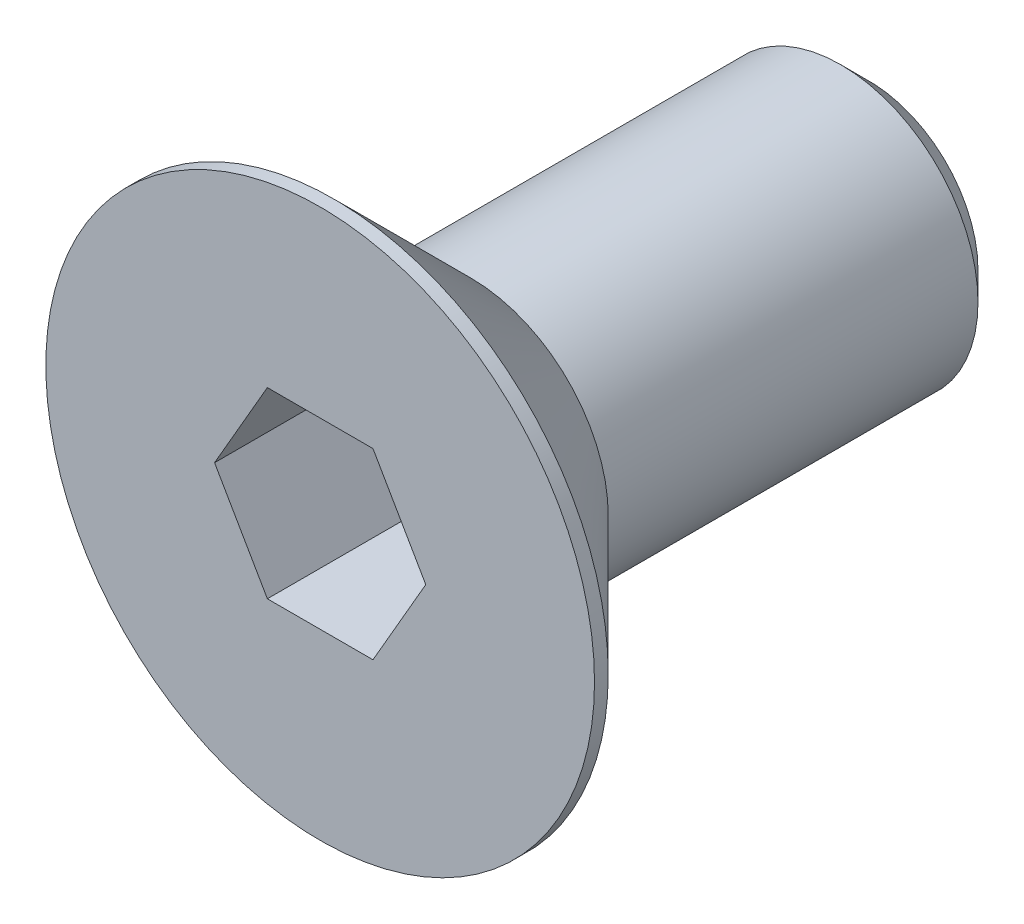
ISO-10303-21;
HEADER;
FILE_DESCRIPTION(('STEP AP214'),'2;1');
FILE_NAME('part.step','',(''),(''),'','','');
FILE_SCHEMA(('AUTOMOTIVE_DESIGN { 1 0 10303 214 1 1 1 1 }'));
ENDSEC;
DATA;
#1=APPLICATION_CONTEXT('core data for automotive mechanical design processes');
#2=APPLICATION_PROTOCOL_DEFINITION('international standard','automotive_design',2000,#1);
#3=PRODUCT_CONTEXT('',#1,'mechanical');
#4=PRODUCT('Part','Part','',(#3));
#5=PRODUCT_RELATED_PRODUCT_CATEGORY('part','',(#4));
#6=PRODUCT_DEFINITION_FORMATION('','',#4);
#7=PRODUCT_DEFINITION_CONTEXT('part definition',#1,'design');
#8=PRODUCT_DEFINITION('design','',#6,#7);
#9=PRODUCT_DEFINITION_SHAPE('','',#8);
#10=(LENGTH_UNIT() NAMED_UNIT(*) SI_UNIT(.MILLI.,.METRE.));
#11=(NAMED_UNIT(*) PLANE_ANGLE_UNIT() SI_UNIT($,.RADIAN.));
#12=(NAMED_UNIT(*) SI_UNIT($,.STERADIAN.) SOLID_ANGLE_UNIT());
#13=UNCERTAINTY_MEASURE_WITH_UNIT(LENGTH_MEASURE(1.E-05),#10,'distance_accuracy_value','');
#14=(GEOMETRIC_REPRESENTATION_CONTEXT(3) GLOBAL_UNCERTAINTY_ASSIGNED_CONTEXT((#13)) GLOBAL_UNIT_ASSIGNED_CONTEXT((#10,
#11,#12)) REPRESENTATION_CONTEXT('',''));
#15=CARTESIAN_POINT('',(0.,0.,0.));
#16=DIRECTION('',(0.,0.,1.));
#17=DIRECTION('',(1.,0.,0.));
#18=AXIS2_PLACEMENT_3D('',#15,#16,#17);
#19=CARTESIAN_POINT('',(0.,0.,-9.));
#20=DIRECTION('',(0.,0.,1.));
#21=DIRECTION('',(1.,0.,0.));
#22=AXIS2_PLACEMENT_3D('',#19,#20,#21);
#23=PLANE('',#22);
#24=CARTESIAN_POINT('',(0.,0.,-9.00000000001455));
#25=DIRECTION('',(0.,0.,1.));
#26=DIRECTION('',(1.,0.,0.));
#27=AXIS2_PLACEMENT_3D('',#24,#25,#26);
#28=CIRCLE('',#27,2.38655000003973);
#29=CARTESIAN_POINT('',(2.38655000003973,0.,-9.00000000001455));
#30=VERTEX_POINT('',#29);
#31=EDGE_CURVE('E19',#30,#30,#28,.T.);
#32=ORIENTED_EDGE('',*,*,#31,.F.);
#33=EDGE_LOOP('',(#32));
#34=FACE_BOUND('',#33,.T.);
#35=ADVANCED_FACE('F16',(#34),#23,.F.);
#36=CARTESIAN_POINT('',(0.,0.,-8.38655000006838));
#37=DIRECTION('',(0.,0.,1.));
#38=DIRECTION('',(1.,0.,0.));
#39=AXIS2_PLACEMENT_3D('',#36,#37,#38);
#40=CONICAL_SURFACE('',#39,2.9999999999859,0.785398163397448);
#41=CARTESIAN_POINT('',(0.,0.,-8.38655));
#42=DIRECTION('',(0.,0.,1.));
#43=DIRECTION('',(1.,0.,0.));
#44=AXIS2_PLACEMENT_3D('',#41,#42,#43);
#45=CIRCLE('',#44,3.);
#46=CARTESIAN_POINT('',(3.,0.,-8.38655));
#47=VERTEX_POINT('',#46);
#48=EDGE_CURVE('E100',#47,#47,#45,.T.);
#49=ORIENTED_EDGE('',*,*,#48,.F.);
#50=EDGE_LOOP('',(#49));
#51=FACE_BOUND('',#50,.T.);
#52=ORIENTED_EDGE('',*,*,#31,.T.);
#53=EDGE_LOOP('',(#52));
#54=FACE_BOUND('',#53,.T.);
#55=ADVANCED_FACE('F107',(#51,#54),#40,.T.);
#56=CARTESIAN_POINT('',(0.,0.,-2.693275));
#57=DIRECTION('',(0.,0.,1.));
#58=DIRECTION('',(1.,0.,0.));
#59=AXIS2_PLACEMENT_3D('',#56,#57,#58);
#60=CYLINDRICAL_SURFACE('',#59,3.);
#61=CARTESIAN_POINT('',(0.,0.,-0.299999999981537));
#62=DIRECTION('',(0.,0.,1.));
#63=DIRECTION('',(-1.,0.,0.));
#64=AXIS2_PLACEMENT_3D('',#61,#62,#63);
#65=CIRCLE('',#64,2.99999999987222);
#66=CARTESIAN_POINT('',(-2.99999999987222,0.,-0.299999999981537));
#67=VERTEX_POINT('',#66);
#68=EDGE_CURVE('E79',#67,#67,#65,.T.);
#69=ORIENTED_EDGE('',*,*,#68,.F.);
#70=EDGE_LOOP('',(#69));
#71=FACE_BOUND('',#70,.T.);
#72=ORIENTED_EDGE('',*,*,#48,.T.);
#73=EDGE_LOOP('',(#72));
#74=FACE_BOUND('',#73,.T.);
#75=ADVANCED_FACE('F114',(#71,#74),#60,.T.);
#76=CARTESIAN_POINT('',(0.,0.,-0.833333333333333));
#77=DIRECTION('',(0.,0.,-1.));
#78=DIRECTION('',(-1.,0.,0.));
#79=AXIS2_PLACEMENT_3D('',#76,#77,#78);
#80=PLANE('',#79);
#81=DIRECTION('',(0.5,0.866025403784439,0.));
#82=VECTOR('',#81,1.);
#83=CARTESIAN_POINT('',(-1.73205080756888,1.,-0.833333333333334));
#84=LINE('',#83,#82);
#85=CARTESIAN_POINT('',(-2.3094010767585,0.,-0.833333333333333));
#86=VERTEX_POINT('',#85);
#87=CARTESIAN_POINT('',(-1.15470053837925,2.,-0.833333333333334));
#88=VERTEX_POINT('',#87);
#89=EDGE_CURVE('E65',#86,#88,#84,.T.);
#90=ORIENTED_EDGE('',*,*,#89,.F.);
#91=DIRECTION('',(-0.5,0.866025403784438,0.));
#92=VECTOR('',#91,1.);
#93=CARTESIAN_POINT('',(-1.73205080756888,-1.,-0.833333333333333));
#94=LINE('',#93,#92);
#95=CARTESIAN_POINT('',(-1.15470053837925,-2.,-0.833333333333333));
#96=VERTEX_POINT('',#95);
#97=EDGE_CURVE('E70',#96,#86,#94,.T.);
#98=ORIENTED_EDGE('',*,*,#97,.F.);
#99=DIRECTION('',(1.,0.,0.));
#100=VECTOR('',#99,1.);
#101=CARTESIAN_POINT('',(0.,-2.,-0.833333333333333));
#102=LINE('',#101,#100);
#103=CARTESIAN_POINT('',(1.15470053837925,-2.,-0.833333333333334));
#104=VERTEX_POINT('',#103);
#105=EDGE_CURVE('E261',#104,#96,#102,.F.);
#106=ORIENTED_EDGE('',*,*,#105,.F.);
#107=DIRECTION('',(-0.5,-0.866025403784439,0.));
#108=VECTOR('',#107,1.);
#109=CARTESIAN_POINT('',(1.73205080756888,-1.,-0.833333333333334));
#110=LINE('',#109,#108);
#111=CARTESIAN_POINT('',(2.3094010767585,0.,-0.833333333333333));
#112=VERTEX_POINT('',#111);
#113=EDGE_CURVE('E264',#112,#104,#110,.T.);
#114=ORIENTED_EDGE('',*,*,#113,.F.);
#115=DIRECTION('',(0.5,-0.866025403784438,0.));
#116=VECTOR('',#115,1.);
#117=CARTESIAN_POINT('',(1.73205080756888,1.,-0.833333333333333));
#118=LINE('',#117,#116);
#119=CARTESIAN_POINT('',(1.15470053837925,2.,-0.833333333333333));
#120=VERTEX_POINT('',#119);
#121=EDGE_CURVE('E246',#120,#112,#118,.T.);
#122=ORIENTED_EDGE('',*,*,#121,.F.);
#123=DIRECTION('',(1.,0.,0.));
#124=VECTOR('',#123,1.);
#125=CARTESIAN_POINT('',(0.,2.,-0.833333333333333));
#126=LINE('',#125,#124);
#127=EDGE_CURVE('E83',#88,#120,#126,.T.);
#128=ORIENTED_EDGE('',*,*,#127,.F.);
#129=EDGE_LOOP('',(#90,#98,#106,#114,#122,#128));
#130=FACE_BOUND('',#129,.T.);
#131=ADVANCED_FACE('F81',(#130),#80,.F.);
#132=CARTESIAN_POINT('',(0.,0.,2.69999999994752));
#133=DIRECTION('',(0.,0.,1.));
#134=DIRECTION('',(1.,0.,0.));
#135=AXIS2_PLACEMENT_3D('',#132,#133,#134);
#136=CONICAL_SURFACE('',#135,5.99999999985812,0.785398163397448);
#137=CARTESIAN_POINT('',(0.,0.,2.7));
#138=DIRECTION('',(0.,0.,1.));
#139=DIRECTION('',(1.,0.,0.));
#140=AXIS2_PLACEMENT_3D('',#137,#138,#139);
#141=CIRCLE('',#140,6.);
#142=CARTESIAN_POINT('',(6.,0.,2.7));
#143=VERTEX_POINT('',#142);
#144=EDGE_CURVE('E94',#143,#143,#141,.T.);
#145=ORIENTED_EDGE('',*,*,#144,.F.);
#146=EDGE_LOOP('',(#145));
#147=FACE_BOUND('',#146,.T.);
#148=ORIENTED_EDGE('',*,*,#68,.T.);
#149=EDGE_LOOP('',(#148));
#150=FACE_BOUND('',#149,.T.);
#151=ADVANCED_FACE('F147',(#147,#150),#136,.T.);
#152=CARTESIAN_POINT('',(-1.73205080756888,-1.,1.08333333333333));
#153=DIRECTION('',(0.866025403784438,0.5,0.));
#154=DIRECTION('',(-0.5,0.866025403784438,0.));
#155=AXIS2_PLACEMENT_3D('',#152,#153,#154);
#156=PLANE('',#155);
#157=DIRECTION('',(0.,0.,1.));
#158=VECTOR('',#157,1.);
#159=CARTESIAN_POINT('',(-2.3094010767585,0.,1.08333333333333));
#160=LINE('',#159,#158);
#161=CARTESIAN_POINT('',(-2.3094010767585,0.,3.));
#162=VERTEX_POINT('',#161);
#163=EDGE_CURVE('E72',#162,#86,#160,.F.);
#164=ORIENTED_EDGE('',*,*,#163,.F.);
#165=DIRECTION('',(-0.5,0.866025403784439,0.));
#166=VECTOR('',#165,1.);
#167=CARTESIAN_POINT('',(-1.15470053837925,-2.,3.));
#168=LINE('',#167,#166);
#169=CARTESIAN_POINT('',(-1.15470053837925,-2.,3.));
#170=VERTEX_POINT('',#169);
#171=EDGE_CURVE('E97',#170,#162,#168,.T.);
#172=ORIENTED_EDGE('',*,*,#171,.F.);
#173=DIRECTION('',(0.,0.,1.));
#174=VECTOR('',#173,1.);
#175=CARTESIAN_POINT('',(-1.15470053837925,-2.,1.08333333333333));
#176=LINE('',#175,#174);
#177=EDGE_CURVE('E75',#96,#170,#176,.T.);
#178=ORIENTED_EDGE('',*,*,#177,.F.);
#179=ORIENTED_EDGE('',*,*,#97,.T.);
#180=EDGE_LOOP('',(#164,#172,#178,#179));
#181=FACE_BOUND('',#180,.T.);
#182=ADVANCED_FACE('F71',(#181),#156,.T.);
#183=CARTESIAN_POINT('',(-1.73205080756888,1.,1.08333333333333));
#184=DIRECTION('',(0.866025403784439,-0.5,0.));
#185=DIRECTION('',(0.5,0.866025403784439,0.));
#186=AXIS2_PLACEMENT_3D('',#183,#184,#185);
#187=PLANE('',#186);
#188=DIRECTION('',(0.,0.,-1.));
#189=VECTOR('',#188,1.);
#190=CARTESIAN_POINT('',(-1.15470053837925,2.,1.08333333333333));
#191=LINE('',#190,#189);
#192=CARTESIAN_POINT('',(-1.15470053837925,2.,3.));
#193=VERTEX_POINT('',#192);
#194=EDGE_CURVE('E85',#193,#88,#191,.T.);
#195=ORIENTED_EDGE('',*,*,#194,.F.);
#196=DIRECTION('',(0.499999999999999,0.866025403784439,0.));
#197=VECTOR('',#196,1.);
#198=CARTESIAN_POINT('',(-2.3094010767585,0.,3.));
#199=LINE('',#198,#197);
#200=EDGE_CURVE('E89',#162,#193,#199,.T.);
#201=ORIENTED_EDGE('',*,*,#200,.F.);
#202=ORIENTED_EDGE('',*,*,#163,.T.);
#203=ORIENTED_EDGE('',*,*,#89,.T.);
#204=EDGE_LOOP('',(#195,#201,#202,#203));
#205=FACE_BOUND('',#204,.T.);
#206=ADVANCED_FACE('F87',(#205),#187,.T.);
#207=CARTESIAN_POINT('',(0.,2.,1.08333333333333));
#208=DIRECTION('',(0.,-1.,0.));
#209=DIRECTION('',(0.,0.,-1.));
#210=AXIS2_PLACEMENT_3D('',#207,#208,#209);
#211=PLANE('',#210);
#212=DIRECTION('',(0.,0.,1.));
#213=VECTOR('',#212,1.);
#214=CARTESIAN_POINT('',(1.15470053837925,2.,1.08333333333333));
#215=LINE('',#214,#213);
#216=CARTESIAN_POINT('',(1.15470053837925,2.,3.));
#217=VERTEX_POINT('',#216);
#218=EDGE_CURVE('E242',#217,#120,#215,.F.);
#219=ORIENTED_EDGE('',*,*,#218,.F.);
#220=DIRECTION('',(1.,0.,0.));
#221=VECTOR('',#220,1.);
#222=CARTESIAN_POINT('',(0.,2.,3.));
#223=LINE('',#222,#221);
#224=EDGE_CURVE('E245',#193,#217,#223,.T.);
#225=ORIENTED_EDGE('',*,*,#224,.F.);
#226=ORIENTED_EDGE('',*,*,#194,.T.);
#227=ORIENTED_EDGE('',*,*,#127,.T.);
#228=EDGE_LOOP('',(#219,#225,#226,#227));
#229=FACE_BOUND('',#228,.T.);
#230=ADVANCED_FACE('F138',(#229),#211,.T.);
#231=CARTESIAN_POINT('',(1.73205080756888,1.,1.08333333333333));
#232=DIRECTION('',(-0.866025403784438,-0.5,0.));
#233=DIRECTION('',(0.5,-0.866025403784438,0.));
#234=AXIS2_PLACEMENT_3D('',#231,#232,#233);
#235=PLANE('',#234);
#236=DIRECTION('',(0.,0.,1.));
#237=VECTOR('',#236,1.);
#238=CARTESIAN_POINT('',(2.3094010767585,0.,1.08333333333333));
#239=LINE('',#238,#237);
#240=CARTESIAN_POINT('',(2.3094010767585,0.,3.));
#241=VERTEX_POINT('',#240);
#242=EDGE_CURVE('E251',#241,#112,#239,.F.);
#243=ORIENTED_EDGE('',*,*,#242,.F.);
#244=DIRECTION('',(0.5,-0.866025403784439,0.));
#245=VECTOR('',#244,1.);
#246=CARTESIAN_POINT('',(1.15470053837925,2.,3.));
#247=LINE('',#246,#245);
#248=EDGE_CURVE('E249',#217,#241,#247,.T.);
#249=ORIENTED_EDGE('',*,*,#248,.F.);
#250=ORIENTED_EDGE('',*,*,#218,.T.);
#251=ORIENTED_EDGE('',*,*,#121,.T.);
#252=EDGE_LOOP('',(#243,#249,#250,#251));
#253=FACE_BOUND('',#252,.T.);
#254=ADVANCED_FACE('F135',(#253),#235,.T.);
#255=CARTESIAN_POINT('',(1.73205080756888,-1.,1.08333333333333));
#256=DIRECTION('',(-0.866025403784439,0.5,0.));
#257=DIRECTION('',(-0.5,-0.866025403784439,0.));
#258=AXIS2_PLACEMENT_3D('',#255,#256,#257);
#259=PLANE('',#258);
#260=DIRECTION('',(0.,0.,1.));
#261=VECTOR('',#260,1.);
#262=CARTESIAN_POINT('',(1.15470053837925,-2.,1.08333333333333));
#263=LINE('',#262,#261);
#264=CARTESIAN_POINT('',(1.15470053837925,-2.,3.));
#265=VERTEX_POINT('',#264);
#266=EDGE_CURVE('E33',#265,#104,#263,.F.);
#267=ORIENTED_EDGE('',*,*,#266,.F.);
#268=DIRECTION('',(-0.499999999999999,-0.866025403784439,0.));
#269=VECTOR('',#268,1.);
#270=CARTESIAN_POINT('',(2.3094010767585,0.,3.));
#271=LINE('',#270,#269);
#272=EDGE_CURVE('E253',#241,#265,#271,.T.);
#273=ORIENTED_EDGE('',*,*,#272,.F.);
#274=ORIENTED_EDGE('',*,*,#242,.T.);
#275=ORIENTED_EDGE('',*,*,#113,.T.);
#276=EDGE_LOOP('',(#267,#273,#274,#275));
#277=FACE_BOUND('',#276,.T.);
#278=ADVANCED_FACE('F131',(#277),#259,.T.);
#279=CARTESIAN_POINT('',(0.,-2.,1.08333333333333));
#280=DIRECTION('',(0.,1.,0.));
#281=DIRECTION('',(0.,0.,1.));
#282=AXIS2_PLACEMENT_3D('',#279,#280,#281);
#283=PLANE('',#282);
#284=ORIENTED_EDGE('',*,*,#177,.T.);
#285=DIRECTION('',(1.,0.,0.));
#286=VECTOR('',#285,1.);
#287=CARTESIAN_POINT('',(0.,-2.,3.));
#288=LINE('',#287,#286);
#289=EDGE_CURVE('E25',#265,#170,#288,.F.);
#290=ORIENTED_EDGE('',*,*,#289,.F.);
#291=ORIENTED_EDGE('',*,*,#266,.T.);
#292=ORIENTED_EDGE('',*,*,#105,.T.);
#293=EDGE_LOOP('',(#284,#290,#291,#292));
#294=FACE_BOUND('',#293,.T.);
#295=ADVANCED_FACE('F124',(#294),#283,.T.);
#296=CARTESIAN_POINT('',(0.,0.,2.85));
#297=DIRECTION('',(0.,0.,1.));
#298=DIRECTION('',(1.,0.,0.));
#299=AXIS2_PLACEMENT_3D('',#296,#297,#298);
#300=CYLINDRICAL_SURFACE('',#299,6.);
#301=CARTESIAN_POINT('',(0.,0.,3.));
#302=DIRECTION('',(0.,0.,1.));
#303=DIRECTION('',(1.,0.,0.));
#304=AXIS2_PLACEMENT_3D('',#301,#302,#303);
#305=CIRCLE('',#304,6.);
#306=CARTESIAN_POINT('',(6.,0.,3.));
#307=VERTEX_POINT('',#306);
#308=EDGE_CURVE('E11',#307,#307,#305,.T.);
#309=ORIENTED_EDGE('',*,*,#308,.F.);
#310=EDGE_LOOP('',(#309));
#311=FACE_BOUND('',#310,.T.);
#312=ORIENTED_EDGE('',*,*,#144,.T.);
#313=EDGE_LOOP('',(#312));
#314=FACE_BOUND('',#313,.T.);
#315=ADVANCED_FACE('F118',(#311,#314),#300,.T.);
#316=CARTESIAN_POINT('',(0.,0.,3.));
#317=DIRECTION('',(0.,0.,1.));
#318=DIRECTION('',(1.,0.,0.));
#319=AXIS2_PLACEMENT_3D('',#316,#317,#318);
#320=PLANE('',#319);
#321=ORIENTED_EDGE('',*,*,#308,.T.);
#322=EDGE_LOOP('',(#321));
#323=FACE_BOUND('',#322,.T.);
#324=ORIENTED_EDGE('',*,*,#272,.T.);
#325=ORIENTED_EDGE('',*,*,#289,.T.);
#326=ORIENTED_EDGE('',*,*,#171,.T.);
#327=ORIENTED_EDGE('',*,*,#200,.T.);
#328=ORIENTED_EDGE('',*,*,#224,.T.);
#329=ORIENTED_EDGE('',*,*,#248,.T.);
#330=EDGE_LOOP('',(#324,#325,#326,#327,#328,#329));
#331=FACE_BOUND('',#330,.T.);
#332=ADVANCED_FACE('F116',(#323,#331),#320,.T.);
#333=CLOSED_SHELL('',(#35,#55,#75,#131,#151,#182,#206,#230,#254,#278,#295,#315,#332));
#334=MANIFOLD_SOLID_BREP('B1',#333);
#335=ADVANCED_BREP_SHAPE_REPRESENTATION('',(#18,#334),#14);
#336=SHAPE_DEFINITION_REPRESENTATION(#9,#335);
ENDSEC;
END-ISO-10303-21;
